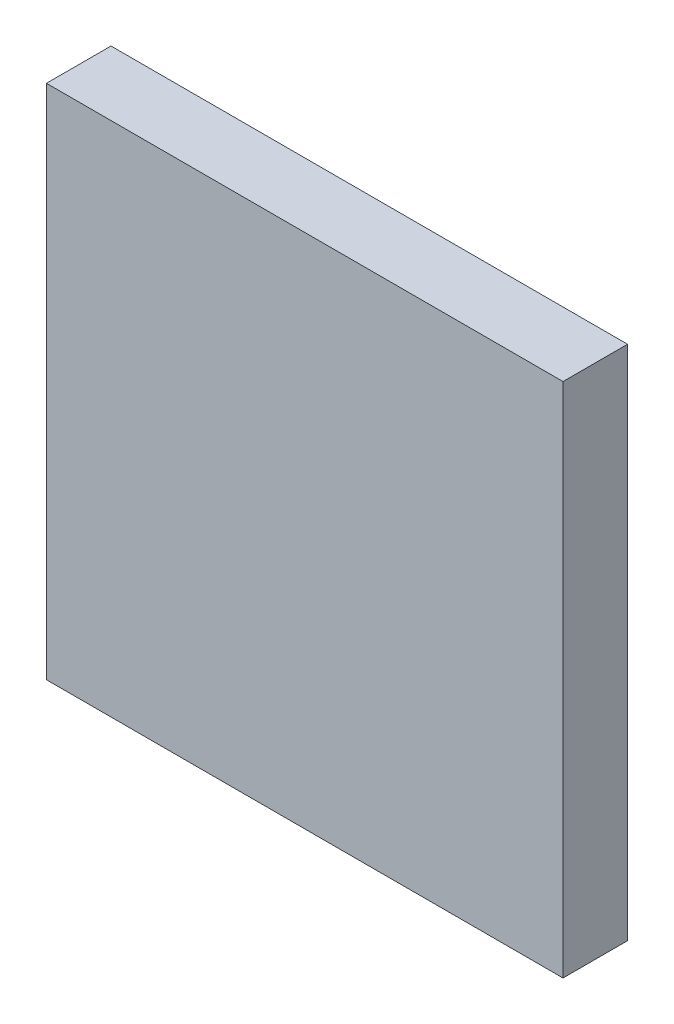
ISO-10303-21;
HEADER;
FILE_DESCRIPTION(('STEP AP214'),'2;1');
FILE_NAME('part.step','',(''),(''),'','','');
FILE_SCHEMA(('AUTOMOTIVE_DESIGN { 1 0 10303 214 1 1 1 1 }'));
ENDSEC;
DATA;
#1=APPLICATION_CONTEXT('core data for automotive mechanical design processes');
#2=APPLICATION_PROTOCOL_DEFINITION('international standard','automotive_design',2000,#1);
#3=PRODUCT_CONTEXT('',#1,'mechanical');
#4=PRODUCT('Part','Part','',(#3));
#5=PRODUCT_RELATED_PRODUCT_CATEGORY('part','',(#4));
#6=PRODUCT_DEFINITION_FORMATION('','',#4);
#7=PRODUCT_DEFINITION_CONTEXT('part definition',#1,'design');
#8=PRODUCT_DEFINITION('design','',#6,#7);
#9=PRODUCT_DEFINITION_SHAPE('','',#8);
#10=(LENGTH_UNIT() NAMED_UNIT(*) SI_UNIT(.MILLI.,.METRE.));
#11=(NAMED_UNIT(*) PLANE_ANGLE_UNIT() SI_UNIT($,.RADIAN.));
#12=(NAMED_UNIT(*) SI_UNIT($,.STERADIAN.) SOLID_ANGLE_UNIT());
#13=UNCERTAINTY_MEASURE_WITH_UNIT(LENGTH_MEASURE(1.E-05),#10,'distance_accuracy_value','');
#14=(GEOMETRIC_REPRESENTATION_CONTEXT(3) GLOBAL_UNCERTAINTY_ASSIGNED_CONTEXT((#13)) GLOBAL_UNIT_ASSIGNED_CONTEXT((#10,
#11,#12)) REPRESENTATION_CONTEXT('',''));
#15=CARTESIAN_POINT('',(0.,0.,0.));
#16=DIRECTION('',(0.,0.,1.));
#17=DIRECTION('',(1.,0.,0.));
#18=AXIS2_PLACEMENT_3D('',#15,#16,#17);
#19=CARTESIAN_POINT('',(20.,40.,-2.5));
#20=DIRECTION('',(-1.,0.,0.));
#21=DIRECTION('',(0.,0.,1.));
#22=AXIS2_PLACEMENT_3D('',#19,#20,#21);
#23=PLANE('',#22);
#24=DIRECTION('',(0.,0.,-1.));
#25=VECTOR('',#24,1.);
#26=CARTESIAN_POINT('',(20.,0.,-2.5));
#27=LINE('',#26,#25);
#28=CARTESIAN_POINT('',(20.,0.,2.5));
#29=VERTEX_POINT('',#28);
#30=CARTESIAN_POINT('',(20.,0.,-2.5));
#31=VERTEX_POINT('',#30);
#32=EDGE_CURVE('E115',#29,#31,#27,.T.);
#33=ORIENTED_EDGE('',*,*,#32,.T.);
#34=DIRECTION('',(0.,-1.,0.));
#35=VECTOR('',#34,1.);
#36=CARTESIAN_POINT('',(20.,40.,-2.5));
#37=LINE('',#36,#35);
#38=CARTESIAN_POINT('',(20.,40.,-2.5));
#39=VERTEX_POINT('',#38);
#40=EDGE_CURVE('E11',#39,#31,#37,.T.);
#41=ORIENTED_EDGE('',*,*,#40,.F.);
#42=DIRECTION('',(0.,0.,-1.));
#43=VECTOR('',#42,1.);
#44=CARTESIAN_POINT('',(20.,40.,-2.5));
#45=LINE('',#44,#43);
#46=CARTESIAN_POINT('',(20.,40.,2.5));
#47=VERTEX_POINT('',#46);
#48=EDGE_CURVE('E96',#47,#39,#45,.T.);
#49=ORIENTED_EDGE('',*,*,#48,.F.);
#50=DIRECTION('',(0.,-1.,0.));
#51=VECTOR('',#50,1.);
#52=CARTESIAN_POINT('',(20.,40.,2.5));
#53=LINE('',#52,#51);
#54=EDGE_CURVE('E108',#47,#29,#53,.T.);
#55=ORIENTED_EDGE('',*,*,#54,.T.);
#56=EDGE_LOOP('',(#33,#41,#49,#55));
#57=FACE_BOUND('',#56,.T.);
#58=ADVANCED_FACE('F42',(#57),#23,.F.);
#59=CARTESIAN_POINT('',(-20.,40.,-2.5));
#60=DIRECTION('',(0.,0.,1.));
#61=DIRECTION('',(1.,0.,0.));
#62=AXIS2_PLACEMENT_3D('',#59,#60,#61);
#63=PLANE('',#62);
#64=DIRECTION('',(-1.,0.,0.));
#65=VECTOR('',#64,1.);
#66=CARTESIAN_POINT('',(-20.,0.,-2.5));
#67=LINE('',#66,#65);
#68=CARTESIAN_POINT('',(-20.,0.,-2.5));
#69=VERTEX_POINT('',#68);
#70=EDGE_CURVE('E102',#31,#69,#67,.T.);
#71=ORIENTED_EDGE('',*,*,#70,.T.);
#72=DIRECTION('',(0.,-1.,0.));
#73=VECTOR('',#72,1.);
#74=CARTESIAN_POINT('',(-20.,40.,-2.5));
#75=LINE('',#74,#73);
#76=CARTESIAN_POINT('',(-20.,40.,-2.5));
#77=VERTEX_POINT('',#76);
#78=EDGE_CURVE('E52',#77,#69,#75,.T.);
#79=ORIENTED_EDGE('',*,*,#78,.F.);
#80=DIRECTION('',(-1.,0.,0.));
#81=VECTOR('',#80,1.);
#82=CARTESIAN_POINT('',(-20.,40.,-2.5));
#83=LINE('',#82,#81);
#84=EDGE_CURVE('E91',#39,#77,#83,.T.);
#85=ORIENTED_EDGE('',*,*,#84,.F.);
#86=ORIENTED_EDGE('',*,*,#40,.T.);
#87=EDGE_LOOP('',(#71,#79,#85,#86));
#88=FACE_BOUND('',#87,.T.);
#89=ADVANCED_FACE('F99',(#88),#63,.F.);
#90=CARTESIAN_POINT('',(-20.,40.,-2.5));
#91=DIRECTION('',(1.,0.,0.));
#92=DIRECTION('',(0.,0.,-1.));
#93=AXIS2_PLACEMENT_3D('',#90,#91,#92);
#94=PLANE('',#93);
#95=DIRECTION('',(0.,0.,1.));
#96=VECTOR('',#95,1.);
#97=CARTESIAN_POINT('',(-20.,0.,-2.5));
#98=LINE('',#97,#96);
#99=CARTESIAN_POINT('',(-20.,0.,2.5));
#100=VERTEX_POINT('',#99);
#101=EDGE_CURVE('E76',#69,#100,#98,.T.);
#102=ORIENTED_EDGE('',*,*,#101,.T.);
#103=DIRECTION('',(0.,-1.,0.));
#104=VECTOR('',#103,1.);
#105=CARTESIAN_POINT('',(-20.,40.,2.5));
#106=LINE('',#105,#104);
#107=CARTESIAN_POINT('',(-20.,40.,2.5));
#108=VERTEX_POINT('',#107);
#109=EDGE_CURVE('E104',#108,#100,#106,.T.);
#110=ORIENTED_EDGE('',*,*,#109,.F.);
#111=DIRECTION('',(0.,0.,1.));
#112=VECTOR('',#111,1.);
#113=CARTESIAN_POINT('',(-20.,40.,-2.5));
#114=LINE('',#113,#112);
#115=EDGE_CURVE('E92',#77,#108,#114,.T.);
#116=ORIENTED_EDGE('',*,*,#115,.F.);
#117=ORIENTED_EDGE('',*,*,#78,.T.);
#118=EDGE_LOOP('',(#102,#110,#116,#117));
#119=FACE_BOUND('',#118,.T.);
#120=ADVANCED_FACE('F101',(#119),#94,.F.);
#121=CARTESIAN_POINT('',(-20.,40.,2.5));
#122=DIRECTION('',(0.,0.,-1.));
#123=DIRECTION('',(-1.,0.,0.));
#124=AXIS2_PLACEMENT_3D('',#121,#122,#123);
#125=PLANE('',#124);
#126=DIRECTION('',(1.,0.,0.));
#127=VECTOR('',#126,1.);
#128=CARTESIAN_POINT('',(-20.,0.,2.5));
#129=LINE('',#128,#127);
#130=EDGE_CURVE('E84',#100,#29,#129,.T.);
#131=ORIENTED_EDGE('',*,*,#130,.T.);
#132=ORIENTED_EDGE('',*,*,#54,.F.);
#133=DIRECTION('',(1.,0.,0.));
#134=VECTOR('',#133,1.);
#135=CARTESIAN_POINT('',(-20.,40.,2.5));
#136=LINE('',#135,#134);
#137=EDGE_CURVE('E62',#108,#47,#136,.T.);
#138=ORIENTED_EDGE('',*,*,#137,.F.);
#139=ORIENTED_EDGE('',*,*,#109,.T.);
#140=EDGE_LOOP('',(#131,#132,#138,#139));
#141=FACE_BOUND('',#140,.T.);
#142=ADVANCED_FACE('F128',(#141),#125,.F.);
#143=CARTESIAN_POINT('',(0.,40.,0.));
#144=DIRECTION('',(0.,1.,0.));
#145=DIRECTION('',(0.,0.,1.));
#146=AXIS2_PLACEMENT_3D('',#143,#144,#145);
#147=PLANE('',#146);
#148=ORIENTED_EDGE('',*,*,#48,.T.);
#149=ORIENTED_EDGE('',*,*,#84,.T.);
#150=ORIENTED_EDGE('',*,*,#115,.T.);
#151=ORIENTED_EDGE('',*,*,#137,.T.);
#152=EDGE_LOOP('',(#148,#149,#150,#151));
#153=FACE_BOUND('',#152,.T.);
#154=ADVANCED_FACE('F95',(#153),#147,.T.);
#155=CARTESIAN_POINT('',(0.,0.,0.));
#156=DIRECTION('',(0.,1.,0.));
#157=DIRECTION('',(0.,0.,1.));
#158=AXIS2_PLACEMENT_3D('',#155,#156,#157);
#159=PLANE('',#158);
#160=CARTESIAN_POINT('',(-12.,0.,0.));
#161=DIRECTION('',(0.,-1.,0.));
#162=DIRECTION('',(0.,0.,-1.));
#163=AXIS2_PLACEMENT_3D('',#160,#161,#162);
#164=CIRCLE('',#163,1.5);
#165=CARTESIAN_POINT('',(-12.,0.,-1.5));
#166=VERTEX_POINT('',#165);
#167=EDGE_CURVE('E141',#166,#166,#164,.T.);
#168=ORIENTED_EDGE('',*,*,#167,.F.);
#169=EDGE_LOOP('',(#168));
#170=FACE_BOUND('',#169,.T.);
#171=CARTESIAN_POINT('',(12.,0.,0.));
#172=DIRECTION('',(0.,-1.,0.));
#173=DIRECTION('',(0.,0.,-1.));
#174=AXIS2_PLACEMENT_3D('',#171,#172,#173);
#175=CIRCLE('',#174,1.5);
#176=CARTESIAN_POINT('',(12.,0.,-1.5));
#177=VERTEX_POINT('',#176);
#178=EDGE_CURVE('E140',#177,#177,#175,.T.);
#179=ORIENTED_EDGE('',*,*,#178,.F.);
#180=EDGE_LOOP('',(#179));
#181=FACE_BOUND('',#180,.T.);
#182=ORIENTED_EDGE('',*,*,#32,.F.);
#183=ORIENTED_EDGE('',*,*,#130,.F.);
#184=ORIENTED_EDGE('',*,*,#101,.F.);
#185=ORIENTED_EDGE('',*,*,#70,.F.);
#186=EDGE_LOOP('',(#182,#183,#184,#185));
#187=FACE_BOUND('',#186,.T.);
#188=ADVANCED_FACE('F129',(#170,#181,#187),#159,.F.);
#189=CARTESIAN_POINT('',(12.,15.,0.));
#190=DIRECTION('',(0.,-1.,0.));
#191=DIRECTION('',(0.,0.,-1.));
#192=AXIS2_PLACEMENT_3D('',#189,#190,#191);
#193=CYLINDRICAL_SURFACE('',#192,1.5);
#194=CARTESIAN_POINT('',(12.,15.,0.));
#195=DIRECTION('',(0.,-1.,0.));
#196=DIRECTION('',(0.,0.,-1.));
#197=AXIS2_PLACEMENT_3D('',#194,#195,#196);
#198=CIRCLE('',#197,1.5);
#199=CARTESIAN_POINT('',(12.,15.,-1.5));
#200=VERTEX_POINT('',#199);
#201=EDGE_CURVE('E133',#200,#200,#198,.T.);
#202=ORIENTED_EDGE('',*,*,#201,.F.);
#203=EDGE_LOOP('',(#202));
#204=FACE_BOUND('',#203,.T.);
#205=ORIENTED_EDGE('',*,*,#178,.T.);
#206=EDGE_LOOP('',(#205));
#207=FACE_BOUND('',#206,.T.);
#208=ADVANCED_FACE('F158',(#204,#207),#193,.F.);
#209=CARTESIAN_POINT('',(12.,15.,0.));
#210=DIRECTION('',(0.,-1.,0.));
#211=DIRECTION('',(0.,0.,-1.));
#212=AXIS2_PLACEMENT_3D('',#209,#210,#211);
#213=PLANE('',#212);
#214=ORIENTED_EDGE('',*,*,#201,.T.);
#215=EDGE_LOOP('',(#214));
#216=FACE_BOUND('',#215,.T.);
#217=ADVANCED_FACE('F154',(#216),#213,.T.);
#218=CARTESIAN_POINT('',(-12.,15.,0.));
#219=DIRECTION('',(0.,-1.,0.));
#220=DIRECTION('',(0.,0.,-1.));
#221=AXIS2_PLACEMENT_3D('',#218,#219,#220);
#222=CYLINDRICAL_SURFACE('',#221,1.5);
#223=CARTESIAN_POINT('',(-12.,15.,0.));
#224=DIRECTION('',(0.,-1.,0.));
#225=DIRECTION('',(0.,0.,-1.));
#226=AXIS2_PLACEMENT_3D('',#223,#224,#225);
#227=CIRCLE('',#226,1.5);
#228=CARTESIAN_POINT('',(-12.,15.,-1.5));
#229=VERTEX_POINT('',#228);
#230=EDGE_CURVE('E117',#229,#229,#227,.T.);
#231=ORIENTED_EDGE('',*,*,#230,.F.);
#232=EDGE_LOOP('',(#231));
#233=FACE_BOUND('',#232,.T.);
#234=ORIENTED_EDGE('',*,*,#167,.T.);
#235=EDGE_LOOP('',(#234));
#236=FACE_BOUND('',#235,.T.);
#237=ADVANCED_FACE('F152',(#233,#236),#222,.F.);
#238=CARTESIAN_POINT('',(-12.,15.,0.));
#239=DIRECTION('',(0.,-1.,0.));
#240=DIRECTION('',(0.,0.,-1.));
#241=AXIS2_PLACEMENT_3D('',#238,#239,#240);
#242=PLANE('',#241);
#243=ORIENTED_EDGE('',*,*,#230,.T.);
#244=EDGE_LOOP('',(#243));
#245=FACE_BOUND('',#244,.T.);
#246=ADVANCED_FACE('F146',(#245),#242,.T.);
#247=CLOSED_SHELL('',(#58,#89,#120,#142,#154,#188,#208,#217,#237,#246));
#248=MANIFOLD_SOLID_BREP('B2',#247);
#249=ADVANCED_BREP_SHAPE_REPRESENTATION('',(#18,#248),#14);
#250=SHAPE_DEFINITION_REPRESENTATION(#9,#249);
ENDSEC;
END-ISO-10303-21;
